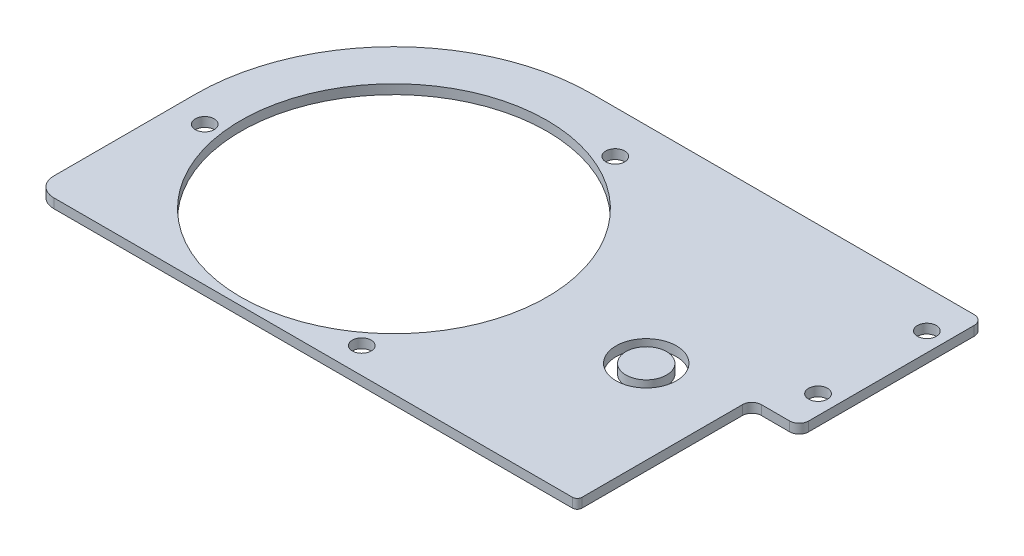
ISO-10303-21;
HEADER;
FILE_DESCRIPTION(('STEP AP214'),'2;1');
FILE_NAME('part.step','',(''),(''),'','','');
FILE_SCHEMA(('AUTOMOTIVE_DESIGN { 1 0 10303 214 1 1 1 1 }'));
ENDSEC;
DATA;
#1=APPLICATION_CONTEXT('core data for automotive mechanical design processes');
#2=APPLICATION_PROTOCOL_DEFINITION('international standard','automotive_design',2000,#1);
#3=PRODUCT_CONTEXT('',#1,'mechanical');
#4=PRODUCT('Part','Part','',(#3));
#5=PRODUCT_RELATED_PRODUCT_CATEGORY('part','',(#4));
#6=PRODUCT_DEFINITION_FORMATION('','',#4);
#7=PRODUCT_DEFINITION_CONTEXT('part definition',#1,'design');
#8=PRODUCT_DEFINITION('design','',#6,#7);
#9=PRODUCT_DEFINITION_SHAPE('','',#8);
#10=(LENGTH_UNIT() NAMED_UNIT(*) SI_UNIT(.MILLI.,.METRE.));
#11=(NAMED_UNIT(*) PLANE_ANGLE_UNIT() SI_UNIT($,.RADIAN.));
#12=(NAMED_UNIT(*) SI_UNIT($,.STERADIAN.) SOLID_ANGLE_UNIT());
#13=UNCERTAINTY_MEASURE_WITH_UNIT(LENGTH_MEASURE(1.E-05),#10,'distance_accuracy_value','');
#14=(GEOMETRIC_REPRESENTATION_CONTEXT(3) GLOBAL_UNCERTAINTY_ASSIGNED_CONTEXT((#13)) GLOBAL_UNIT_ASSIGNED_CONTEXT((#10,
#11,#12)) REPRESENTATION_CONTEXT('',''));
#15=CARTESIAN_POINT('',(0.,0.,0.));
#16=DIRECTION('',(0.,0.,1.));
#17=DIRECTION('',(1.,0.,0.));
#18=AXIS2_PLACEMENT_3D('',#15,#16,#17);
#19=CARTESIAN_POINT('',(-120.668920929197,6.35,95.2310790708027));
#20=DIRECTION('',(0.,-1.,0.));
#21=DIRECTION('',(0.,0.,-1.));
#22=AXIS2_PLACEMENT_3D('',#19,#20,#21);
#23=PLANE('',#22);
#24=CARTESIAN_POINT('',(68.8184042889801,6.35,90.4470456369459));
#25=DIRECTION('',(0.,1.,0.));
#26=DIRECTION('',(0.,0.,1.));
#27=AXIS2_PLACEMENT_3D('',#24,#25,#26);
#28=CIRCLE('',#27,6.35000000000515);
#29=CARTESIAN_POINT('',(68.8184042889801,6.35,96.7970456369511));
#30=VERTEX_POINT('',#29);
#31=EDGE_CURVE('E52',#30,#30,#28,.T.);
#32=ORIENTED_EDGE('',*,*,#31,.F.);
#33=EDGE_LOOP('',(#32));
#34=FACE_BOUND('',#33,.T.);
#35=CARTESIAN_POINT('',(43.9202370743556,6.35,-104.822009180638));
#36=DIRECTION('',(0.,1.,0.));
#37=DIRECTION('',(0.,0.,1.));
#38=AXIS2_PLACEMENT_3D('',#35,#36,#37);
#39=CIRCLE('',#38,6.35000000000716);
#40=CARTESIAN_POINT('',(43.9202370743556,6.35,-98.4720091806305));
#41=VERTEX_POINT('',#40);
#42=EDGE_CURVE('E188',#41,#41,#39,.T.);
#43=ORIENTED_EDGE('',*,*,#42,.F.);
#44=EDGE_LOOP('',(#43));
#45=FACE_BOUND('',#44,.T.);
#46=CARTESIAN_POINT('',(250.171079070803,6.35,-34.8507771089668));
#47=DIRECTION('',(0.,1.,0.));
#48=DIRECTION('',(0.,0.,1.));
#49=AXIS2_PLACEMENT_3D('',#46,#47,#48);
#50=CIRCLE('',#49,6.34999999999993);
#51=CARTESIAN_POINT('',(250.171079070803,6.35,-28.5007771089669));
#52=VERTEX_POINT('',#51);
#53=EDGE_CURVE('E182',#52,#52,#50,.T.);
#54=ORIENTED_EDGE('',*,*,#53,.F.);
#55=EDGE_LOOP('',(#54));
#56=FACE_BOUND('',#55,.T.);
#57=CARTESIAN_POINT('',(250.171079070803,6.35,-107.968920929197));
#58=DIRECTION('',(0.,1.,0.));
#59=DIRECTION('',(0.,0.,1.));
#60=AXIS2_PLACEMENT_3D('',#57,#58,#59);
#61=CIRCLE('',#60,6.34999999999999);
#62=CARTESIAN_POINT('',(250.171079070803,6.35,-101.618920929198));
#63=VERTEX_POINT('',#62);
#64=EDGE_CURVE('E176',#63,#63,#61,.T.);
#65=ORIENTED_EDGE('',*,*,#64,.F.);
#66=EDGE_LOOP('',(#65));
#67=FACE_BOUND('',#66,.T.);
#68=CARTESIAN_POINT('',(-112.738641363336,6.35,14.3749635436917));
#69=DIRECTION('',(0.,1.,0.));
#70=DIRECTION('',(0.,0.,1.));
#71=AXIS2_PLACEMENT_3D('',#68,#69,#70);
#72=CIRCLE('',#71,6.34999999998765);
#73=CARTESIAN_POINT('',(-112.738641363336,6.35,20.7249635436794));
#74=VERTEX_POINT('',#73);
#75=EDGE_CURVE('E169',#74,#74,#72,.T.);
#76=ORIENTED_EDGE('',*,*,#75,.F.);
#77=EDGE_LOOP('',(#76));
#78=FACE_BOUND('',#77,.T.);
#79=CARTESIAN_POINT('',(0.,6.35,0.));
#80=DIRECTION('',(0.,1.,0.));
#81=DIRECTION('',(0.,0.,1.));
#82=AXIS2_PLACEMENT_3D('',#79,#80,#81);
#83=CIRCLE('',#82,102.87);
#84=CARTESIAN_POINT('',(0.,6.35,102.87));
#85=VERTEX_POINT('',#84);
#86=EDGE_CURVE('E166',#85,#85,#83,.T.);
#87=ORIENTED_EDGE('',*,*,#86,.F.);
#88=EDGE_LOOP('',(#87));
#89=FACE_BOUND('',#88,.T.);
#90=CARTESIAN_POINT('',(-120.668920929197,6.35,95.2310790708027));
#91=DIRECTION('',(0.,1.,0.));
#92=DIRECTION('',(0.,0.,-1.));
#93=AXIS2_PLACEMENT_3D('',#90,#91,#92);
#94=CIRCLE('',#93,12.7);
#95=CARTESIAN_POINT('',(-133.368920929197,6.35,95.2310790708027));
#96=VERTEX_POINT('',#95);
#97=CARTESIAN_POINT('',(-120.668920929197,6.35,107.931079070803));
#98=VERTEX_POINT('',#97);
#99=EDGE_CURVE('E136',#96,#98,#94,.T.);
#100=ORIENTED_EDGE('',*,*,#99,.T.);
#101=DIRECTION('',(1.,0.,0.));
#102=VECTOR('',#101,1.);
#103=CARTESIAN_POINT('',(227.955539535401,6.35,107.931079070803));
#104=LINE('',#103,#102);
#105=CARTESIAN_POINT('',(227.955539535401,6.35,107.931079070803));
#106=VERTEX_POINT('',#105);
#107=EDGE_CURVE('E129',#98,#106,#104,.T.);
#108=ORIENTED_EDGE('',*,*,#107,.T.);
#109=CARTESIAN_POINT('',(227.955539535401,6.35,104.765539535401));
#110=DIRECTION('',(0.,1.,0.));
#111=DIRECTION('',(0.,0.,1.));
#112=AXIS2_PLACEMENT_3D('',#109,#110,#111);
#113=CIRCLE('',#112,3.16553953540139);
#114=CARTESIAN_POINT('',(231.121079070803,6.35,104.765539535401));
#115=VERTEX_POINT('',#114);
#116=EDGE_CURVE('E133',#106,#115,#113,.T.);
#117=ORIENTED_EDGE('',*,*,#116,.T.);
#118=DIRECTION('',(0.,0.,-1.));
#119=VECTOR('',#118,1.);
#120=CARTESIAN_POINT('',(231.121079070803,6.35,104.765539535401));
#121=LINE('',#120,#119);
#122=CARTESIAN_POINT('',(231.121079070803,6.35,-3.1007771089668));
#123=VERTEX_POINT('',#122);
#124=EDGE_CURVE('E154',#115,#123,#121,.T.);
#125=ORIENTED_EDGE('',*,*,#124,.T.);
#126=CARTESIAN_POINT('',(237.471079070803,6.35,-3.1007771089668));
#127=DIRECTION('',(0.,-1.,0.));
#128=DIRECTION('',(0.,0.,1.));
#129=AXIS2_PLACEMENT_3D('',#126,#127,#128);
#130=CIRCLE('',#129,6.35);
#131=CARTESIAN_POINT('',(237.471079070803,6.35,-9.4507771089668));
#132=VERTEX_POINT('',#131);
#133=EDGE_CURVE('E156',#123,#132,#130,.T.);
#134=ORIENTED_EDGE('',*,*,#133,.T.);
#135=DIRECTION('',(1.,0.,0.));
#136=VECTOR('',#135,1.);
#137=CARTESIAN_POINT('',(237.471079070803,6.35,-9.4507771089668));
#138=LINE('',#137,#136);
#139=CARTESIAN_POINT('',(256.521079070803,6.35,-9.4507771089668));
#140=VERTEX_POINT('',#139);
#141=EDGE_CURVE('E258',#132,#140,#138,.T.);
#142=ORIENTED_EDGE('',*,*,#141,.T.);
#143=CARTESIAN_POINT('',(256.521079070803,6.35,-15.8007771089668));
#144=DIRECTION('',(0.,1.,0.));
#145=DIRECTION('',(0.,0.,-1.));
#146=AXIS2_PLACEMENT_3D('',#143,#144,#145);
#147=CIRCLE('',#146,6.35000000000001);
#148=CARTESIAN_POINT('',(262.871079070803,6.35,-15.8007771089668));
#149=VERTEX_POINT('',#148);
#150=EDGE_CURVE('E256',#140,#149,#147,.T.);
#151=ORIENTED_EDGE('',*,*,#150,.T.);
#152=DIRECTION('',(0.,0.,-1.));
#153=VECTOR('',#152,1.);
#154=CARTESIAN_POINT('',(262.871079070803,6.35,-127.018920929198));
#155=LINE('',#154,#153);
#156=CARTESIAN_POINT('',(262.871079070803,6.35,-127.018920929198));
#157=VERTEX_POINT('',#156);
#158=EDGE_CURVE('E254',#149,#157,#155,.T.);
#159=ORIENTED_EDGE('',*,*,#158,.T.);
#160=CARTESIAN_POINT('',(256.521079070803,6.35,-127.018920929198));
#161=DIRECTION('',(0.,1.,0.));
#162=DIRECTION('',(0.,0.,-1.));
#163=AXIS2_PLACEMENT_3D('',#160,#161,#162);
#164=CIRCLE('',#163,6.34999999999997);
#165=CARTESIAN_POINT('',(256.521079070803,6.35,-133.368920929197));
#166=VERTEX_POINT('',#165);
#167=EDGE_CURVE('E252',#157,#166,#164,.T.);
#168=ORIENTED_EDGE('',*,*,#167,.T.);
#169=DIRECTION('',(-1.,0.,0.));
#170=VECTOR('',#169,1.);
#171=CARTESIAN_POINT('',(256.521079070803,6.35,-133.368920929197));
#172=LINE('',#171,#170);
#173=CARTESIAN_POINT('',(0.,6.35,-133.368920929197));
#174=VERTEX_POINT('',#173);
#175=EDGE_CURVE('E250',#166,#174,#172,.T.);
#176=ORIENTED_EDGE('',*,*,#175,.T.);
#177=CARTESIAN_POINT('',(0.,6.35,0.));
#178=DIRECTION('',(0.,1.,0.));
#179=DIRECTION('',(0.,0.,-1.));
#180=AXIS2_PLACEMENT_3D('',#177,#178,#179);
#181=CIRCLE('',#180,133.368920929197);
#182=CARTESIAN_POINT('',(-133.368920929197,6.35,0.));
#183=VERTEX_POINT('',#182);
#184=EDGE_CURVE('E248',#174,#183,#181,.T.);
#185=ORIENTED_EDGE('',*,*,#184,.T.);
#186=DIRECTION('',(0.,0.,1.));
#187=VECTOR('',#186,1.);
#188=CARTESIAN_POINT('',(-133.368920929197,6.35,0.));
#189=LINE('',#188,#187);
#190=EDGE_CURVE('E191',#183,#96,#189,.T.);
#191=ORIENTED_EDGE('',*,*,#190,.T.);
#192=EDGE_LOOP('',(#100,#108,#117,#125,#134,#142,#151,#159,#168,#176,#185,#191));
#193=FACE_BOUND('',#192,.T.);
#194=CARTESIAN_POINT('',(174.73868956695,6.35,5.18954712317254));
#195=DIRECTION('',(0.,-1.,0.));
#196=DIRECTION('',(0.,0.,-1.));
#197=AXIS2_PLACEMENT_3D('',#194,#195,#196);
#198=CIRCLE('',#197,20.32);
#199=CARTESIAN_POINT('',(174.73868956695,6.35,-15.1304528768275));
#200=VERTEX_POINT('',#199);
#201=EDGE_CURVE('E12',#200,#200,#198,.F.);
#202=ORIENTED_EDGE('',*,*,#201,.F.);
#203=EDGE_LOOP('',(#202));
#204=FACE_BOUND('',#203,.T.);
#205=ADVANCED_FACE('F43',(#34,#45,#56,#67,#78,#89,#193,#204),#23,.F.);
#206=CARTESIAN_POINT('',(-120.668920929197,0.,95.2310790708027));
#207=DIRECTION('',(0.,-1.,0.));
#208=DIRECTION('',(0.,0.,-1.));
#209=AXIS2_PLACEMENT_3D('',#206,#207,#208);
#210=PLANE('',#209);
#211=CARTESIAN_POINT('',(43.9202370743556,0.,-104.822009180638));
#212=DIRECTION('',(0.,1.,0.));
#213=DIRECTION('',(0.,0.,1.));
#214=AXIS2_PLACEMENT_3D('',#211,#212,#213);
#215=CIRCLE('',#214,6.35000000000716);
#216=CARTESIAN_POINT('',(43.9202370743556,0.,-98.4720091806305));
#217=VERTEX_POINT('',#216);
#218=EDGE_CURVE('E179',#217,#217,#215,.T.);
#219=ORIENTED_EDGE('',*,*,#218,.T.);
#220=EDGE_LOOP('',(#219));
#221=FACE_BOUND('',#220,.T.);
#222=CARTESIAN_POINT('',(250.171079070803,0.,-107.968920929197));
#223=DIRECTION('',(0.,1.,0.));
#224=DIRECTION('',(0.,0.,1.));
#225=AXIS2_PLACEMENT_3D('',#222,#223,#224);
#226=CIRCLE('',#225,6.34999999999999);
#227=CARTESIAN_POINT('',(250.171079070803,0.,-101.618920929198));
#228=VERTEX_POINT('',#227);
#229=EDGE_CURVE('E165',#228,#228,#226,.T.);
#230=ORIENTED_EDGE('',*,*,#229,.T.);
#231=EDGE_LOOP('',(#230));
#232=FACE_BOUND('',#231,.T.);
#233=CARTESIAN_POINT('',(0.,0.,0.));
#234=DIRECTION('',(0.,1.,0.));
#235=DIRECTION('',(0.,0.,1.));
#236=AXIS2_PLACEMENT_3D('',#233,#234,#235);
#237=CIRCLE('',#236,102.87);
#238=CARTESIAN_POINT('',(0.,0.,102.87));
#239=VERTEX_POINT('',#238);
#240=EDGE_CURVE('E161',#239,#239,#237,.T.);
#241=ORIENTED_EDGE('',*,*,#240,.T.);
#242=EDGE_LOOP('',(#241));
#243=FACE_BOUND('',#242,.T.);
#244=CARTESIAN_POINT('',(-120.668920929197,0.,95.2310790708027));
#245=DIRECTION('',(0.,1.,0.));
#246=DIRECTION('',(0.,0.,-1.));
#247=AXIS2_PLACEMENT_3D('',#244,#245,#246);
#248=CIRCLE('',#247,12.7);
#249=CARTESIAN_POINT('',(-133.368920929197,0.,95.2310790708027));
#250=VERTEX_POINT('',#249);
#251=CARTESIAN_POINT('',(-120.668920929197,0.,107.931079070803));
#252=VERTEX_POINT('',#251);
#253=EDGE_CURVE('E230',#250,#252,#248,.T.);
#254=ORIENTED_EDGE('',*,*,#253,.F.);
#255=DIRECTION('',(0.,0.,1.));
#256=VECTOR('',#255,1.);
#257=CARTESIAN_POINT('',(-133.368920929197,0.,0.));
#258=LINE('',#257,#256);
#259=CARTESIAN_POINT('',(-133.368920929197,0.,0.));
#260=VERTEX_POINT('',#259);
#261=EDGE_CURVE('E60',#260,#250,#258,.T.);
#262=ORIENTED_EDGE('',*,*,#261,.F.);
#263=CARTESIAN_POINT('',(0.,0.,0.));
#264=DIRECTION('',(0.,1.,0.));
#265=DIRECTION('',(0.,0.,-1.));
#266=AXIS2_PLACEMENT_3D('',#263,#264,#265);
#267=CIRCLE('',#266,133.368920929197);
#268=CARTESIAN_POINT('',(0.,0.,-133.368920929197));
#269=VERTEX_POINT('',#268);
#270=EDGE_CURVE('E308',#269,#260,#267,.T.);
#271=ORIENTED_EDGE('',*,*,#270,.F.);
#272=DIRECTION('',(-1.,0.,0.));
#273=VECTOR('',#272,1.);
#274=CARTESIAN_POINT('',(256.521079070803,0.,-133.368920929197));
#275=LINE('',#274,#273);
#276=CARTESIAN_POINT('',(256.521079070803,0.,-133.368920929197));
#277=VERTEX_POINT('',#276);
#278=EDGE_CURVE('E299',#277,#269,#275,.T.);
#279=ORIENTED_EDGE('',*,*,#278,.F.);
#280=CARTESIAN_POINT('',(256.521079070803,0.,-127.018920929198));
#281=DIRECTION('',(0.,1.,0.));
#282=DIRECTION('',(0.,0.,-1.));
#283=AXIS2_PLACEMENT_3D('',#280,#281,#282);
#284=CIRCLE('',#283,6.34999999999997);
#285=CARTESIAN_POINT('',(262.871079070803,0.,-127.018920929198));
#286=VERTEX_POINT('',#285);
#287=EDGE_CURVE('E300',#286,#277,#284,.T.);
#288=ORIENTED_EDGE('',*,*,#287,.F.);
#289=DIRECTION('',(0.,0.,-1.));
#290=VECTOR('',#289,1.);
#291=CARTESIAN_POINT('',(262.871079070803,0.,-127.018920929198));
#292=LINE('',#291,#290);
#293=CARTESIAN_POINT('',(262.871079070803,0.,-15.8007771089668));
#294=VERTEX_POINT('',#293);
#295=EDGE_CURVE('E282',#294,#286,#292,.T.);
#296=ORIENTED_EDGE('',*,*,#295,.F.);
#297=CARTESIAN_POINT('',(256.521079070803,0.,-15.8007771089668));
#298=DIRECTION('',(0.,1.,0.));
#299=DIRECTION('',(0.,0.,-1.));
#300=AXIS2_PLACEMENT_3D('',#297,#298,#299);
#301=CIRCLE('',#300,6.35000000000001);
#302=CARTESIAN_POINT('',(256.521079070803,0.,-9.4507771089668));
#303=VERTEX_POINT('',#302);
#304=EDGE_CURVE('E273',#303,#294,#301,.T.);
#305=ORIENTED_EDGE('',*,*,#304,.F.);
#306=DIRECTION('',(1.,0.,0.));
#307=VECTOR('',#306,1.);
#308=CARTESIAN_POINT('',(237.471079070803,0.,-9.4507771089668));
#309=LINE('',#308,#307);
#310=CARTESIAN_POINT('',(237.471079070803,0.,-9.4507771089668));
#311=VERTEX_POINT('',#310);
#312=EDGE_CURVE('E274',#311,#303,#309,.T.);
#313=ORIENTED_EDGE('',*,*,#312,.F.);
#314=CARTESIAN_POINT('',(237.471079070803,0.,-3.1007771089668));
#315=DIRECTION('',(0.,-1.,0.));
#316=DIRECTION('',(0.,0.,1.));
#317=AXIS2_PLACEMENT_3D('',#314,#315,#316);
#318=CIRCLE('',#317,6.35);
#319=CARTESIAN_POINT('',(231.121079070803,0.,-3.1007771089668));
#320=VERTEX_POINT('',#319);
#321=EDGE_CURVE('E270',#320,#311,#318,.T.);
#322=ORIENTED_EDGE('',*,*,#321,.F.);
#323=DIRECTION('',(0.,0.,-1.));
#324=VECTOR('',#323,1.);
#325=CARTESIAN_POINT('',(231.121079070803,0.,104.765539535401));
#326=LINE('',#325,#324);
#327=CARTESIAN_POINT('',(231.121079070803,0.,104.765539535401));
#328=VERTEX_POINT('',#327);
#329=EDGE_CURVE('E147',#328,#320,#326,.T.);
#330=ORIENTED_EDGE('',*,*,#329,.F.);
#331=CARTESIAN_POINT('',(227.955539535401,0.,104.765539535401));
#332=DIRECTION('',(0.,1.,0.));
#333=DIRECTION('',(0.,0.,1.));
#334=AXIS2_PLACEMENT_3D('',#331,#332,#333);
#335=CIRCLE('',#334,3.16553953540139);
#336=CARTESIAN_POINT('',(227.955539535401,0.,107.931079070803));
#337=VERTEX_POINT('',#336);
#338=EDGE_CURVE('E148',#337,#328,#335,.T.);
#339=ORIENTED_EDGE('',*,*,#338,.F.);
#340=DIRECTION('',(1.,0.,0.));
#341=VECTOR('',#340,1.);
#342=CARTESIAN_POINT('',(227.955539535401,0.,107.931079070803));
#343=LINE('',#342,#341);
#344=EDGE_CURVE('E144',#252,#337,#343,.T.);
#345=ORIENTED_EDGE('',*,*,#344,.F.);
#346=EDGE_LOOP('',(#254,#262,#271,#279,#288,#296,#305,#313,#322,#330,#339,#345));
#347=FACE_BOUND('',#346,.T.);
#348=CARTESIAN_POINT('',(-112.738641363336,0.,14.3749635436917));
#349=DIRECTION('',(0.,1.,0.));
#350=DIRECTION('',(0.,0.,1.));
#351=AXIS2_PLACEMENT_3D('',#348,#349,#350);
#352=CIRCLE('',#351,6.34999999998765);
#353=CARTESIAN_POINT('',(-112.738641363336,0.,20.7249635436794));
#354=VERTEX_POINT('',#353);
#355=EDGE_CURVE('E164',#354,#354,#352,.T.);
#356=ORIENTED_EDGE('',*,*,#355,.T.);
#357=EDGE_LOOP('',(#356));
#358=FACE_BOUND('',#357,.T.);
#359=CARTESIAN_POINT('',(250.171079070803,0.,-34.8507771089668));
#360=DIRECTION('',(0.,1.,0.));
#361=DIRECTION('',(0.,0.,1.));
#362=AXIS2_PLACEMENT_3D('',#359,#360,#361);
#363=CIRCLE('',#362,6.34999999999993);
#364=CARTESIAN_POINT('',(250.171079070803,0.,-28.5007771089669));
#365=VERTEX_POINT('',#364);
#366=EDGE_CURVE('E173',#365,#365,#363,.T.);
#367=ORIENTED_EDGE('',*,*,#366,.T.);
#368=EDGE_LOOP('',(#367));
#369=FACE_BOUND('',#368,.T.);
#370=CARTESIAN_POINT('',(68.8184042889801,0.,90.4470456369459));
#371=DIRECTION('',(0.,1.,0.));
#372=DIRECTION('',(0.,0.,1.));
#373=AXIS2_PLACEMENT_3D('',#370,#371,#372);
#374=CIRCLE('',#373,6.35000000000515);
#375=CARTESIAN_POINT('',(68.8184042889801,0.,96.7970456369511));
#376=VERTEX_POINT('',#375);
#377=EDGE_CURVE('E185',#376,#376,#374,.T.);
#378=ORIENTED_EDGE('',*,*,#377,.T.);
#379=EDGE_LOOP('',(#378));
#380=FACE_BOUND('',#379,.T.);
#381=CARTESIAN_POINT('',(174.73868956695,0.,5.18954712317254));
#382=DIRECTION('',(0.,1.,0.));
#383=DIRECTION('',(0.,0.,1.));
#384=AXIS2_PLACEMENT_3D('',#381,#382,#383);
#385=CIRCLE('',#384,20.32);
#386=CARTESIAN_POINT('',(174.73868956695,0.,25.5095471231726));
#387=VERTEX_POINT('',#386);
#388=EDGE_CURVE('E46',#387,#387,#385,.T.);
#389=ORIENTED_EDGE('',*,*,#388,.T.);
#390=EDGE_LOOP('',(#389));
#391=FACE_BOUND('',#390,.T.);
#392=ADVANCED_FACE('F204',(#221,#232,#243,#347,#358,#369,#380,#391),#210,.T.);
#393=CARTESIAN_POINT('',(-120.668920929197,6.35,95.2310790708027));
#394=DIRECTION('',(0.,-1.,0.));
#395=DIRECTION('',(0.,0.,-1.));
#396=AXIS2_PLACEMENT_3D('',#393,#394,#395);
#397=CYLINDRICAL_SURFACE('',#396,12.7);
#398=ORIENTED_EDGE('',*,*,#253,.T.);
#399=DIRECTION('',(0.,-1.,0.));
#400=VECTOR('',#399,1.);
#401=CARTESIAN_POINT('',(-120.668920929197,6.35,107.931079070803));
#402=LINE('',#401,#400);
#403=EDGE_CURVE('E321',#98,#252,#402,.T.);
#404=ORIENTED_EDGE('',*,*,#403,.F.);
#405=ORIENTED_EDGE('',*,*,#99,.F.);
#406=DIRECTION('',(0.,-1.,0.));
#407=VECTOR('',#406,1.);
#408=CARTESIAN_POINT('',(-133.368920929197,6.35,95.2310790708027));
#409=LINE('',#408,#407);
#410=EDGE_CURVE('E240',#96,#250,#409,.T.);
#411=ORIENTED_EDGE('',*,*,#410,.T.);
#412=EDGE_LOOP('',(#398,#404,#405,#411));
#413=FACE_BOUND('',#412,.T.);
#414=ADVANCED_FACE('F225',(#413),#397,.T.);
#415=CARTESIAN_POINT('',(227.955539535401,6.35,107.931079070803));
#416=DIRECTION('',(0.,0.,-1.));
#417=DIRECTION('',(-1.,0.,0.));
#418=AXIS2_PLACEMENT_3D('',#415,#416,#417);
#419=PLANE('',#418);
#420=ORIENTED_EDGE('',*,*,#344,.T.);
#421=DIRECTION('',(0.,-1.,0.));
#422=VECTOR('',#421,1.);
#423=CARTESIAN_POINT('',(227.955539535401,6.35,107.931079070803));
#424=LINE('',#423,#422);
#425=EDGE_CURVE('E142',#106,#337,#424,.T.);
#426=ORIENTED_EDGE('',*,*,#425,.F.);
#427=ORIENTED_EDGE('',*,*,#107,.F.);
#428=ORIENTED_EDGE('',*,*,#403,.T.);
#429=EDGE_LOOP('',(#420,#426,#427,#428));
#430=FACE_BOUND('',#429,.T.);
#431=ADVANCED_FACE('F143',(#430),#419,.F.);
#432=CARTESIAN_POINT('',(227.955539535401,6.35,104.765539535401));
#433=DIRECTION('',(0.,-1.,0.));
#434=DIRECTION('',(0.,0.,-1.));
#435=AXIS2_PLACEMENT_3D('',#432,#433,#434);
#436=CYLINDRICAL_SURFACE('',#435,3.16553953540139);
#437=ORIENTED_EDGE('',*,*,#338,.T.);
#438=DIRECTION('',(0.,-1.,0.));
#439=VECTOR('',#438,1.);
#440=CARTESIAN_POINT('',(231.121079070803,6.35,104.765539535401));
#441=LINE('',#440,#439);
#442=EDGE_CURVE('E152',#115,#328,#441,.T.);
#443=ORIENTED_EDGE('',*,*,#442,.F.);
#444=ORIENTED_EDGE('',*,*,#116,.F.);
#445=ORIENTED_EDGE('',*,*,#425,.T.);
#446=EDGE_LOOP('',(#437,#443,#444,#445));
#447=FACE_BOUND('',#446,.T.);
#448=ADVANCED_FACE('F150',(#447),#436,.T.);
#449=CARTESIAN_POINT('',(231.121079070803,6.35,104.765539535401));
#450=DIRECTION('',(-1.,0.,0.));
#451=DIRECTION('',(0.,0.,1.));
#452=AXIS2_PLACEMENT_3D('',#449,#450,#451);
#453=PLANE('',#452);
#454=ORIENTED_EDGE('',*,*,#329,.T.);
#455=DIRECTION('',(0.,-1.,0.));
#456=VECTOR('',#455,1.);
#457=CARTESIAN_POINT('',(231.121079070803,6.35,-3.1007771089668));
#458=LINE('',#457,#456);
#459=EDGE_CURVE('E325',#123,#320,#458,.T.);
#460=ORIENTED_EDGE('',*,*,#459,.F.);
#461=ORIENTED_EDGE('',*,*,#124,.F.);
#462=ORIENTED_EDGE('',*,*,#442,.T.);
#463=EDGE_LOOP('',(#454,#460,#461,#462));
#464=FACE_BOUND('',#463,.T.);
#465=ADVANCED_FACE('F339',(#464),#453,.F.);
#466=CARTESIAN_POINT('',(237.471079070803,6.35,-3.1007771089668));
#467=DIRECTION('',(0.,-1.,0.));
#468=DIRECTION('',(0.,0.,-1.));
#469=AXIS2_PLACEMENT_3D('',#466,#467,#468);
#470=CYLINDRICAL_SURFACE('',#469,6.35);
#471=ORIENTED_EDGE('',*,*,#321,.T.);
#472=DIRECTION('',(0.,-1.,0.));
#473=VECTOR('',#472,1.);
#474=CARTESIAN_POINT('',(237.471079070803,6.35,-9.4507771089668));
#475=LINE('',#474,#473);
#476=EDGE_CURVE('E267',#132,#311,#475,.T.);
#477=ORIENTED_EDGE('',*,*,#476,.F.);
#478=ORIENTED_EDGE('',*,*,#133,.F.);
#479=ORIENTED_EDGE('',*,*,#459,.T.);
#480=EDGE_LOOP('',(#471,#477,#478,#479));
#481=FACE_BOUND('',#480,.T.);
#482=ADVANCED_FACE('F268',(#481),#470,.F.);
#483=CARTESIAN_POINT('',(237.471079070803,6.35,-9.4507771089668));
#484=DIRECTION('',(0.,0.,-1.));
#485=DIRECTION('',(-1.,0.,0.));
#486=AXIS2_PLACEMENT_3D('',#483,#484,#485);
#487=PLANE('',#486);
#488=ORIENTED_EDGE('',*,*,#312,.T.);
#489=DIRECTION('',(0.,-1.,0.));
#490=VECTOR('',#489,1.);
#491=CARTESIAN_POINT('',(256.521079070803,6.35,-9.4507771089668));
#492=LINE('',#491,#490);
#493=EDGE_CURVE('E278',#140,#303,#492,.T.);
#494=ORIENTED_EDGE('',*,*,#493,.F.);
#495=ORIENTED_EDGE('',*,*,#141,.F.);
#496=ORIENTED_EDGE('',*,*,#476,.T.);
#497=EDGE_LOOP('',(#488,#494,#495,#496));
#498=FACE_BOUND('',#497,.T.);
#499=ADVANCED_FACE('F276',(#498),#487,.F.);
#500=CARTESIAN_POINT('',(256.521079070803,6.35,-15.8007771089668));
#501=DIRECTION('',(0.,-1.,0.));
#502=DIRECTION('',(0.,0.,-1.));
#503=AXIS2_PLACEMENT_3D('',#500,#501,#502);
#504=CYLINDRICAL_SURFACE('',#503,6.35000000000001);
#505=ORIENTED_EDGE('',*,*,#304,.T.);
#506=DIRECTION('',(0.,-1.,0.));
#507=VECTOR('',#506,1.);
#508=CARTESIAN_POINT('',(262.871079070803,6.35,-15.8007771089668));
#509=LINE('',#508,#507);
#510=EDGE_CURVE('E287',#149,#294,#509,.T.);
#511=ORIENTED_EDGE('',*,*,#510,.F.);
#512=ORIENTED_EDGE('',*,*,#150,.F.);
#513=ORIENTED_EDGE('',*,*,#493,.T.);
#514=EDGE_LOOP('',(#505,#511,#512,#513));
#515=FACE_BOUND('',#514,.T.);
#516=ADVANCED_FACE('F285',(#515),#504,.T.);
#517=CARTESIAN_POINT('',(262.871079070803,6.35,-127.018920929198));
#518=DIRECTION('',(-1.,0.,0.));
#519=DIRECTION('',(0.,0.,1.));
#520=AXIS2_PLACEMENT_3D('',#517,#518,#519);
#521=PLANE('',#520);
#522=ORIENTED_EDGE('',*,*,#295,.T.);
#523=DIRECTION('',(0.,-1.,0.));
#524=VECTOR('',#523,1.);
#525=CARTESIAN_POINT('',(262.871079070803,6.35,-127.018920929198));
#526=LINE('',#525,#524);
#527=EDGE_CURVE('E294',#157,#286,#526,.T.);
#528=ORIENTED_EDGE('',*,*,#527,.F.);
#529=ORIENTED_EDGE('',*,*,#158,.F.);
#530=ORIENTED_EDGE('',*,*,#510,.T.);
#531=EDGE_LOOP('',(#522,#528,#529,#530));
#532=FACE_BOUND('',#531,.T.);
#533=ADVANCED_FACE('F295',(#532),#521,.F.);
#534=CARTESIAN_POINT('',(256.521079070803,6.35,-127.018920929198));
#535=DIRECTION('',(0.,-1.,0.));
#536=DIRECTION('',(0.,0.,-1.));
#537=AXIS2_PLACEMENT_3D('',#534,#535,#536);
#538=CYLINDRICAL_SURFACE('',#537,6.34999999999997);
#539=ORIENTED_EDGE('',*,*,#287,.T.);
#540=DIRECTION('',(0.,-1.,0.));
#541=VECTOR('',#540,1.);
#542=CARTESIAN_POINT('',(256.521079070803,6.35,-133.368920929197));
#543=LINE('',#542,#541);
#544=EDGE_CURVE('E304',#166,#277,#543,.T.);
#545=ORIENTED_EDGE('',*,*,#544,.F.);
#546=ORIENTED_EDGE('',*,*,#167,.F.);
#547=ORIENTED_EDGE('',*,*,#527,.T.);
#548=EDGE_LOOP('',(#539,#545,#546,#547));
#549=FACE_BOUND('',#548,.T.);
#550=ADVANCED_FACE('F302',(#549),#538,.T.);
#551=CARTESIAN_POINT('',(256.521079070803,6.35,-133.368920929197));
#552=DIRECTION('',(0.,0.,1.));
#553=DIRECTION('',(1.,0.,0.));
#554=AXIS2_PLACEMENT_3D('',#551,#552,#553);
#555=PLANE('',#554);
#556=ORIENTED_EDGE('',*,*,#278,.T.);
#557=DIRECTION('',(0.,-1.,0.));
#558=VECTOR('',#557,1.);
#559=CARTESIAN_POINT('',(0.,6.35,-133.368920929197));
#560=LINE('',#559,#558);
#561=EDGE_CURVE('E313',#174,#269,#560,.T.);
#562=ORIENTED_EDGE('',*,*,#561,.F.);
#563=ORIENTED_EDGE('',*,*,#175,.F.);
#564=ORIENTED_EDGE('',*,*,#544,.T.);
#565=EDGE_LOOP('',(#556,#562,#563,#564));
#566=FACE_BOUND('',#565,.T.);
#567=ADVANCED_FACE('F311',(#566),#555,.F.);
#568=CARTESIAN_POINT('',(0.,6.35,0.));
#569=DIRECTION('',(0.,-1.,0.));
#570=DIRECTION('',(0.,0.,-1.));
#571=AXIS2_PLACEMENT_3D('',#568,#569,#570);
#572=CYLINDRICAL_SURFACE('',#571,133.368920929197);
#573=ORIENTED_EDGE('',*,*,#270,.T.);
#574=DIRECTION('',(0.,-1.,0.));
#575=VECTOR('',#574,1.);
#576=CARTESIAN_POINT('',(-133.368920929197,6.35,0.));
#577=LINE('',#576,#575);
#578=EDGE_CURVE('E170',#183,#260,#577,.T.);
#579=ORIENTED_EDGE('',*,*,#578,.F.);
#580=ORIENTED_EDGE('',*,*,#184,.F.);
#581=ORIENTED_EDGE('',*,*,#561,.T.);
#582=EDGE_LOOP('',(#573,#579,#580,#581));
#583=FACE_BOUND('',#582,.T.);
#584=ADVANCED_FACE('F318',(#583),#572,.T.);
#585=CARTESIAN_POINT('',(-133.368920929197,6.35,0.));
#586=DIRECTION('',(1.,0.,0.));
#587=DIRECTION('',(0.,0.,-1.));
#588=AXIS2_PLACEMENT_3D('',#585,#586,#587);
#589=PLANE('',#588);
#590=ORIENTED_EDGE('',*,*,#261,.T.);
#591=ORIENTED_EDGE('',*,*,#410,.F.);
#592=ORIENTED_EDGE('',*,*,#190,.F.);
#593=ORIENTED_EDGE('',*,*,#578,.T.);
#594=EDGE_LOOP('',(#590,#591,#592,#593));
#595=FACE_BOUND('',#594,.T.);
#596=ADVANCED_FACE('F219',(#595),#589,.F.);
#597=CARTESIAN_POINT('',(0.,6.35,0.));
#598=DIRECTION('',(0.,-1.,0.));
#599=DIRECTION('',(0.,0.,-1.));
#600=AXIS2_PLACEMENT_3D('',#597,#598,#599);
#601=CYLINDRICAL_SURFACE('',#600,102.87);
#602=ORIENTED_EDGE('',*,*,#86,.T.);
#603=EDGE_LOOP('',(#602));
#604=FACE_BOUND('',#603,.T.);
#605=ORIENTED_EDGE('',*,*,#240,.F.);
#606=EDGE_LOOP('',(#605));
#607=FACE_BOUND('',#606,.T.);
#608=ADVANCED_FACE('F215',(#604,#607),#601,.F.);
#609=CARTESIAN_POINT('',(-112.738641363336,6.35,14.3749635436917));
#610=DIRECTION('',(0.,-1.,0.));
#611=DIRECTION('',(0.,0.,-1.));
#612=AXIS2_PLACEMENT_3D('',#609,#610,#611);
#613=CYLINDRICAL_SURFACE('',#612,6.34999999998765);
#614=ORIENTED_EDGE('',*,*,#75,.T.);
#615=EDGE_LOOP('',(#614));
#616=FACE_BOUND('',#615,.T.);
#617=ORIENTED_EDGE('',*,*,#355,.F.);
#618=EDGE_LOOP('',(#617));
#619=FACE_BOUND('',#618,.T.);
#620=ADVANCED_FACE('F218',(#616,#619),#613,.F.);
#621=CARTESIAN_POINT('',(250.171079070803,6.35,-107.968920929197));
#622=DIRECTION('',(0.,-1.,0.));
#623=DIRECTION('',(0.,0.,-1.));
#624=AXIS2_PLACEMENT_3D('',#621,#622,#623);
#625=CYLINDRICAL_SURFACE('',#624,6.34999999999999);
#626=ORIENTED_EDGE('',*,*,#64,.T.);
#627=EDGE_LOOP('',(#626));
#628=FACE_BOUND('',#627,.T.);
#629=ORIENTED_EDGE('',*,*,#229,.F.);
#630=EDGE_LOOP('',(#629));
#631=FACE_BOUND('',#630,.T.);
#632=ADVANCED_FACE('F366',(#628,#631),#625,.F.);
#633=CARTESIAN_POINT('',(250.171079070803,6.35,-34.8507771089668));
#634=DIRECTION('',(0.,-1.,0.));
#635=DIRECTION('',(0.,0.,-1.));
#636=AXIS2_PLACEMENT_3D('',#633,#634,#635);
#637=CYLINDRICAL_SURFACE('',#636,6.34999999999993);
#638=ORIENTED_EDGE('',*,*,#53,.T.);
#639=EDGE_LOOP('',(#638));
#640=FACE_BOUND('',#639,.T.);
#641=ORIENTED_EDGE('',*,*,#366,.F.);
#642=EDGE_LOOP('',(#641));
#643=FACE_BOUND('',#642,.T.);
#644=ADVANCED_FACE('F370',(#640,#643),#637,.F.);
#645=CARTESIAN_POINT('',(43.9202370743556,6.35,-104.822009180638));
#646=DIRECTION('',(0.,-1.,0.));
#647=DIRECTION('',(0.,0.,-1.));
#648=AXIS2_PLACEMENT_3D('',#645,#646,#647);
#649=CYLINDRICAL_SURFACE('',#648,6.35000000000716);
#650=ORIENTED_EDGE('',*,*,#42,.T.);
#651=EDGE_LOOP('',(#650));
#652=FACE_BOUND('',#651,.T.);
#653=ORIENTED_EDGE('',*,*,#218,.F.);
#654=EDGE_LOOP('',(#653));
#655=FACE_BOUND('',#654,.T.);
#656=ADVANCED_FACE('F374',(#652,#655),#649,.F.);
#657=CARTESIAN_POINT('',(68.8184042889801,6.35,90.4470456369459));
#658=DIRECTION('',(0.,-1.,0.));
#659=DIRECTION('',(0.,0.,-1.));
#660=AXIS2_PLACEMENT_3D('',#657,#658,#659);
#661=CYLINDRICAL_SURFACE('',#660,6.35000000000515);
#662=ORIENTED_EDGE('',*,*,#31,.T.);
#663=EDGE_LOOP('',(#662));
#664=FACE_BOUND('',#663,.T.);
#665=ORIENTED_EDGE('',*,*,#377,.F.);
#666=EDGE_LOOP('',(#665));
#667=FACE_BOUND('',#666,.T.);
#668=ADVANCED_FACE('F199',(#664,#667),#661,.F.);
#669=CARTESIAN_POINT('',(174.73868956695,28.448,5.18954712317254));
#670=DIRECTION('',(0.,-1.,0.));
#671=DIRECTION('',(0.,0.,-1.));
#672=AXIS2_PLACEMENT_3D('',#669,#670,#671);
#673=CYLINDRICAL_SURFACE('',#672,20.32);
#674=ORIENTED_EDGE('',*,*,#388,.F.);
#675=EDGE_LOOP('',(#674));
#676=FACE_BOUND('',#675,.T.);
#677=ORIENTED_EDGE('',*,*,#201,.T.);
#678=EDGE_LOOP('',(#677));
#679=FACE_BOUND('',#678,.T.);
#680=ADVANCED_FACE('F381',(#676,#679),#673,.F.);
#681=CLOSED_SHELL('',(#205,#392,#414,#431,#448,#465,#482,#499,#516,#533,#550,#567,#584,#596,
#608,#620,#632,#644,#656,#668,#680));
#682=MANIFOLD_SOLID_BREP('B2',#681);
#683=CARTESIAN_POINT('',(-120.668920929197,0.,95.2310790708027));
#684=DIRECTION('',(0.,-1.,0.));
#685=DIRECTION('',(0.,0.,-1.));
#686=AXIS2_PLACEMENT_3D('',#683,#684,#685);
#687=PLANE('',#686);
#688=CARTESIAN_POINT('',(174.73868956695,0.,5.18954712317254));
#689=DIRECTION('',(0.,1.,0.));
#690=DIRECTION('',(0.,0.,1.));
#691=AXIS2_PLACEMENT_3D('',#688,#689,#690);
#692=CIRCLE('',#691,13.6394001701797);
#693=CARTESIAN_POINT('',(174.73868956695,0.,18.8289472933522));
#694=VERTEX_POINT('',#693);
#695=EDGE_CURVE('E540',#694,#694,#692,.T.);
#696=ORIENTED_EDGE('',*,*,#695,.F.);
#697=EDGE_LOOP('',(#696));
#698=FACE_BOUND('',#697,.T.);
#699=ADVANCED_FACE('F534',(#698),#687,.T.);
#700=CARTESIAN_POINT('',(174.73868956695,28.448,5.18954712317254));
#701=DIRECTION('',(0.,-1.,0.));
#702=DIRECTION('',(0.,0.,-1.));
#703=AXIS2_PLACEMENT_3D('',#700,#701,#702);
#704=CYLINDRICAL_SURFACE('',#703,13.6394001701797);
#705=ORIENTED_EDGE('',*,*,#695,.T.);
#706=EDGE_LOOP('',(#705));
#707=FACE_BOUND('',#706,.T.);
#708=CARTESIAN_POINT('',(174.73868956695,6.35,5.18954712317254));
#709=DIRECTION('',(0.,-1.,0.));
#710=DIRECTION('',(0.,0.,-1.));
#711=AXIS2_PLACEMENT_3D('',#708,#709,#710);
#712=CIRCLE('',#711,13.6394001701797);
#713=CARTESIAN_POINT('',(174.73868956695,6.35,-8.44985304700716));
#714=VERTEX_POINT('',#713);
#715=EDGE_CURVE('E42',#714,#714,#712,.F.);
#716=ORIENTED_EDGE('',*,*,#715,.F.);
#717=EDGE_LOOP('',(#716));
#718=FACE_BOUND('',#717,.T.);
#719=ADVANCED_FACE('F546',(#707,#718),#704,.T.);
#720=CARTESIAN_POINT('',(-120.668920929197,6.35,95.2310790708027));
#721=DIRECTION('',(0.,-1.,0.));
#722=DIRECTION('',(0.,0.,-1.));
#723=AXIS2_PLACEMENT_3D('',#720,#721,#722);
#724=PLANE('',#723);
#725=ORIENTED_EDGE('',*,*,#715,.T.);
#726=EDGE_LOOP('',(#725));
#727=FACE_BOUND('',#726,.T.);
#728=ADVANCED_FACE('F553',(#727),#724,.F.);
#729=CLOSED_SHELL('',(#699,#719,#728));
#730=MANIFOLD_SOLID_BREP('B6',#729);
#731=ADVANCED_BREP_SHAPE_REPRESENTATION('',(#18,#682,#730),#14);
#732=SHAPE_DEFINITION_REPRESENTATION(#9,#731);
ENDSEC;
END-ISO-10303-21;
